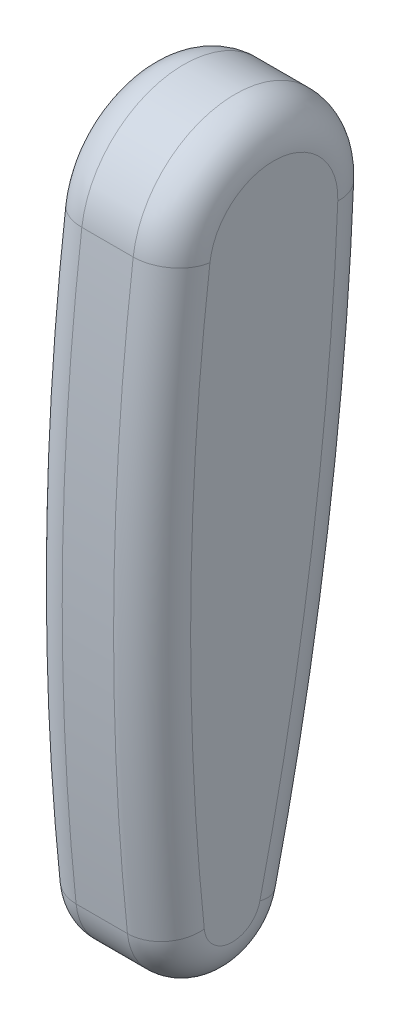
ISO-10303-21;
HEADER;
FILE_DESCRIPTION(('STEP AP214'),'2;1');
FILE_NAME('part.step','',(''),(''),'','','');
FILE_SCHEMA(('AUTOMOTIVE_DESIGN { 1 0 10303 214 1 1 1 1 }'));
ENDSEC;
DATA;
#1=APPLICATION_CONTEXT('core data for automotive mechanical design processes');
#2=APPLICATION_PROTOCOL_DEFINITION('international standard','automotive_design',2000,#1);
#3=PRODUCT_CONTEXT('',#1,'mechanical');
#4=PRODUCT('Part','Part','',(#3));
#5=PRODUCT_RELATED_PRODUCT_CATEGORY('part','',(#4));
#6=PRODUCT_DEFINITION_FORMATION('','',#4);
#7=PRODUCT_DEFINITION_CONTEXT('part definition',#1,'design');
#8=PRODUCT_DEFINITION('design','',#6,#7);
#9=PRODUCT_DEFINITION_SHAPE('','',#8);
#10=(LENGTH_UNIT() NAMED_UNIT(*) SI_UNIT(.MILLI.,.METRE.));
#11=(NAMED_UNIT(*) PLANE_ANGLE_UNIT() SI_UNIT($,.RADIAN.));
#12=(NAMED_UNIT(*) SI_UNIT($,.STERADIAN.) SOLID_ANGLE_UNIT());
#13=UNCERTAINTY_MEASURE_WITH_UNIT(LENGTH_MEASURE(1.E-05),#10,'distance_accuracy_value','');
#14=(GEOMETRIC_REPRESENTATION_CONTEXT(3) GLOBAL_UNCERTAINTY_ASSIGNED_CONTEXT((#13)) GLOBAL_UNIT_ASSIGNED_CONTEXT((#10,
#11,#12)) REPRESENTATION_CONTEXT('',''));
#15=CARTESIAN_POINT('',(0.,0.,0.));
#16=DIRECTION('',(0.,0.,1.));
#17=DIRECTION('',(1.,0.,0.));
#18=AXIS2_PLACEMENT_3D('',#15,#16,#17);
#19=CARTESIAN_POINT('',(222.25,-234.840307231112,-1250.38847130733));
#20=DIRECTION('',(1.,0.,0.));
#21=DIRECTION('',(0.,0.,-1.));
#22=AXIS2_PLACEMENT_3D('',#19,#20,#21);
#23=CYLINDRICAL_SURFACE('',#22,1270.);
#24=DIRECTION('',(1.,0.,0.));
#25=VECTOR('',#24,1.);
#26=CARTESIAN_POINT('',(222.25,-366.573375726702,12.7609255039649));
#27=LINE('',#26,#25);
#28=CARTESIAN_POINT('',(241.3,-366.573375726702,12.7609255039649));
#29=VERTEX_POINT('',#28);
#30=CARTESIAN_POINT('',(266.7,-366.573375726702,12.7609255039649));
#31=VERTEX_POINT('',#30);
#32=EDGE_CURVE('E140',#29,#31,#27,.T.);
#33=ORIENTED_EDGE('',*,*,#32,.T.);
#34=CARTESIAN_POINT('',(266.7,-234.840307231112,-1250.38847130733));
#35=DIRECTION('',(-1.,0.,0.));
#36=DIRECTION('',(0.,0.,1.));
#37=AXIS2_PLACEMENT_3D('',#34,#35,#36);
#38=CIRCLE('',#37,1270.);
#39=CARTESIAN_POINT('',(266.7,-78.2306079922428,9.91839692132181));
#40=VERTEX_POINT('',#39);
#41=EDGE_CURVE('E161',#31,#40,#38,.T.);
#42=ORIENTED_EDGE('',*,*,#41,.T.);
#43=DIRECTION('',(1.,0.,0.));
#44=VECTOR('',#43,1.);
#45=CARTESIAN_POINT('',(222.25,-78.2306079922428,9.91839692132181));
#46=LINE('',#45,#44);
#47=CARTESIAN_POINT('',(241.3,-78.2306079922428,9.91839692132181));
#48=VERTEX_POINT('',#47);
#49=EDGE_CURVE('E114',#48,#40,#46,.T.);
#50=ORIENTED_EDGE('',*,*,#49,.F.);
#51=CARTESIAN_POINT('',(241.3,-234.840307231112,-1250.38847130733));
#52=DIRECTION('',(-1.,0.,0.));
#53=DIRECTION('',(0.,0.,1.));
#54=AXIS2_PLACEMENT_3D('',#51,#52,#53);
#55=CIRCLE('',#54,1270.);
#56=EDGE_CURVE('E159',#48,#29,#55,.F.);
#57=ORIENTED_EDGE('',*,*,#56,.T.);
#58=EDGE_LOOP('',(#33,#42,#50,#57));
#59=FACE_BOUND('',#58,.T.);
#60=ADVANCED_FACE('F30',(#59),#23,.T.);
#61=CARTESIAN_POINT('',(222.25,-84.4949959617975,-40.4938778078239));
#62=DIRECTION('',(1.,0.,0.));
#63=DIRECTION('',(0.,0.,-1.));
#64=AXIS2_PLACEMENT_3D('',#61,#62,#63);
#65=CYLINDRICAL_SURFACE('',#64,50.7999999999996);
#66=ORIENTED_EDGE('',*,*,#49,.T.);
#67=CARTESIAN_POINT('',(266.7,-84.4949959617975,-40.4938778078239));
#68=DIRECTION('',(-1.,0.,0.));
#69=DIRECTION('',(0.,0.,1.));
#70=AXIS2_PLACEMENT_3D('',#67,#68,#69);
#71=CIRCLE('',#70,50.7999999999996);
#72=CARTESIAN_POINT('',(266.7,-86.6438502438308,-91.2484088890444));
#73=VERTEX_POINT('',#72);
#74=EDGE_CURVE('E113',#40,#73,#71,.T.);
#75=ORIENTED_EDGE('',*,*,#74,.T.);
#76=DIRECTION('',(1.,0.,0.));
#77=VECTOR('',#76,1.);
#78=CARTESIAN_POINT('',(222.25,-86.6438502438308,-91.2484088890444));
#79=LINE('',#78,#77);
#80=CARTESIAN_POINT('',(241.3,-86.6438502438308,-91.2484088890444));
#81=VERTEX_POINT('',#80);
#82=EDGE_CURVE('E96',#81,#73,#79,.T.);
#83=ORIENTED_EDGE('',*,*,#82,.F.);
#84=CARTESIAN_POINT('',(241.3,-84.4949959617975,-40.4938778078239));
#85=DIRECTION('',(-1.,0.,0.));
#86=DIRECTION('',(0.,0.,1.));
#87=AXIS2_PLACEMENT_3D('',#84,#85,#86);
#88=CIRCLE('',#87,50.7999999999996);
#89=EDGE_CURVE('E110',#81,#48,#88,.F.);
#90=ORIENTED_EDGE('',*,*,#89,.T.);
#91=EDGE_LOOP('',(#66,#75,#83,#90));
#92=FACE_BOUND('',#91,.T.);
#93=ADVANCED_FACE('F109',(#92),#65,.T.);
#94=CARTESIAN_POINT('',(222.25,-22.1782217828215,1431.38752354757));
#95=DIRECTION('',(1.,0.,0.));
#96=DIRECTION('',(0.,0.,-1.));
#97=AXIS2_PLACEMENT_3D('',#94,#95,#96);
#98=CYLINDRICAL_SURFACE('',#97,1524.);
#99=ORIENTED_EDGE('',*,*,#82,.T.);
#100=CARTESIAN_POINT('',(266.7,-22.1782217828215,1431.38752354757));
#101=DIRECTION('',(-1.,0.,0.));
#102=DIRECTION('',(0.,0.,1.));
#103=AXIS2_PLACEMENT_3D('',#100,#101,#102);
#104=CIRCLE('',#103,1524.);
#105=CARTESIAN_POINT('',(266.7,-370.699612750108,-52.2259166848305));
#106=VERTEX_POINT('',#105);
#107=EDGE_CURVE('E102',#73,#106,#104,.T.);
#108=ORIENTED_EDGE('',*,*,#107,.T.);
#109=DIRECTION('',(1.,0.,0.));
#110=VECTOR('',#109,1.);
#111=CARTESIAN_POINT('',(222.25,-370.699612750108,-52.2259166848305));
#112=LINE('',#111,#110);
#113=CARTESIAN_POINT('',(241.3,-370.699612750108,-52.2259166848305));
#114=VERTEX_POINT('',#113);
#115=EDGE_CURVE('E98',#114,#106,#112,.T.);
#116=ORIENTED_EDGE('',*,*,#115,.F.);
#117=CARTESIAN_POINT('',(241.3,-22.1782217828215,1431.38752354757));
#118=DIRECTION('',(-1.,0.,0.));
#119=DIRECTION('',(0.,0.,1.));
#120=AXIS2_PLACEMENT_3D('',#117,#118,#119);
#121=CIRCLE('',#120,1524.);
#122=EDGE_CURVE('E93',#114,#81,#121,.F.);
#123=ORIENTED_EDGE('',*,*,#122,.T.);
#124=EDGE_LOOP('',(#99,#108,#116,#123));
#125=FACE_BOUND('',#124,.T.);
#126=ADVANCED_FACE('F95',(#125),#98,.T.);
#127=CARTESIAN_POINT('',(222.25,-363.148315945816,-20.0809588131286));
#128=DIRECTION('',(1.,0.,0.));
#129=DIRECTION('',(0.,0.,-1.));
#130=AXIS2_PLACEMENT_3D('',#127,#128,#129);
#131=CYLINDRICAL_SURFACE('',#130,33.0199999999998);
#132=ORIENTED_EDGE('',*,*,#115,.T.);
#133=CARTESIAN_POINT('',(266.7,-363.148315945816,-20.0809588131286));
#134=DIRECTION('',(-1.,0.,0.));
#135=DIRECTION('',(0.,0.,1.));
#136=AXIS2_PLACEMENT_3D('',#133,#134,#135);
#137=CIRCLE('',#136,33.0199999999998);
#138=EDGE_CURVE('E157',#106,#31,#137,.T.);
#139=ORIENTED_EDGE('',*,*,#138,.T.);
#140=ORIENTED_EDGE('',*,*,#32,.F.);
#141=CARTESIAN_POINT('',(241.3,-363.148315945816,-20.0809588131286));
#142=DIRECTION('',(-1.,0.,0.));
#143=DIRECTION('',(0.,0.,1.));
#144=AXIS2_PLACEMENT_3D('',#141,#142,#143);
#145=CIRCLE('',#144,33.0199999999998);
#146=EDGE_CURVE('E155',#29,#114,#145,.F.);
#147=ORIENTED_EDGE('',*,*,#146,.T.);
#148=EDGE_LOOP('',(#132,#139,#140,#147));
#149=FACE_BOUND('',#148,.T.);
#150=ADVANCED_FACE('F177',(#149),#131,.T.);
#151=CARTESIAN_POINT('',(222.25,-159.667651596455,-645.441174557577));
#152=DIRECTION('',(-1.,0.,0.));
#153=DIRECTION('',(0.,0.,1.));
#154=AXIS2_PLACEMENT_3D('',#151,#152,#153);
#155=PLANE('',#154);
#156=CARTESIAN_POINT('',(222.25,-22.1782217828215,1431.38752354757));
#157=DIRECTION('',(-1.,0.,0.));
#158=DIRECTION('',(0.,0.,1.));
#159=AXIS2_PLACEMENT_3D('',#156,#157,#158);
#160=CIRCLE('',#159,1504.95);
#161=CARTESIAN_POINT('',(222.25,-85.8380298880682,-72.2154597335864));
#162=VERTEX_POINT('',#161);
#163=CARTESIAN_POINT('',(222.25,-366.343095363017,-33.6807486819255));
#164=VERTEX_POINT('',#163);
#165=EDGE_CURVE('E37',#162,#164,#160,.T.);
#166=ORIENTED_EDGE('',*,*,#165,.T.);
#167=CARTESIAN_POINT('',(222.25,-363.148315945816,-20.0809588131286));
#168=DIRECTION('',(-1.,0.,0.));
#169=DIRECTION('',(0.,0.,1.));
#170=AXIS2_PLACEMENT_3D('',#167,#168,#169);
#171=CIRCLE('',#170,13.9699999999998);
#172=CARTESIAN_POINT('',(222.25,-364.597379699268,-6.18631544820469));
#173=VERTEX_POINT('',#172);
#174=EDGE_CURVE('E11',#164,#173,#171,.T.);
#175=ORIENTED_EDGE('',*,*,#174,.T.);
#176=CARTESIAN_POINT('',(222.25,-234.840307231112,-1250.38847130733));
#177=DIRECTION('',(-1.,0.,0.));
#178=DIRECTION('',(0.,0.,1.));
#179=AXIS2_PLACEMENT_3D('',#176,#177,#178);
#180=CIRCLE('',#179,1250.95);
#181=CARTESIAN_POINT('',(222.25,-80.5797534808258,-8.98620610210795));
#182=VERTEX_POINT('',#181);
#183=EDGE_CURVE('E163',#173,#182,#180,.T.);
#184=ORIENTED_EDGE('',*,*,#183,.T.);
#185=CARTESIAN_POINT('',(222.25,-84.4949959617975,-40.4938778078239));
#186=DIRECTION('',(-1.,0.,0.));
#187=DIRECTION('',(0.,0.,1.));
#188=AXIS2_PLACEMENT_3D('',#185,#186,#187);
#189=CIRCLE('',#188,31.7499999999996);
#190=EDGE_CURVE('E47',#182,#162,#189,.T.);
#191=ORIENTED_EDGE('',*,*,#190,.T.);
#192=EDGE_LOOP('',(#166,#175,#184,#191));
#193=FACE_BOUND('',#192,.T.);
#194=ADVANCED_FACE('F166',(#193),#155,.T.);
#195=CARTESIAN_POINT('',(285.75,-159.667651596455,-645.441174557577));
#196=DIRECTION('',(-1.,0.,0.));
#197=DIRECTION('',(0.,0.,1.));
#198=AXIS2_PLACEMENT_3D('',#195,#196,#197);
#199=PLANE('',#198);
#200=CARTESIAN_POINT('',(285.75,-22.1782217828215,1431.38752354757));
#201=DIRECTION('',(-1.,0.,0.));
#202=DIRECTION('',(0.,0.,1.));
#203=AXIS2_PLACEMENT_3D('',#200,#201,#202);
#204=CIRCLE('',#203,1504.95);
#205=CARTESIAN_POINT('',(285.75,-366.343095363016,-33.6807486819255));
#206=VERTEX_POINT('',#205);
#207=CARTESIAN_POINT('',(285.75,-85.8380298880683,-72.2154597335864));
#208=VERTEX_POINT('',#207);
#209=EDGE_CURVE('E150',#206,#208,#204,.F.);
#210=ORIENTED_EDGE('',*,*,#209,.T.);
#211=CARTESIAN_POINT('',(285.75,-84.4949959617975,-40.4938778078239));
#212=DIRECTION('',(-1.,0.,0.));
#213=DIRECTION('',(0.,0.,1.));
#214=AXIS2_PLACEMENT_3D('',#211,#212,#213);
#215=CIRCLE('',#214,31.7499999999996);
#216=CARTESIAN_POINT('',(285.75,-80.5797534808258,-8.98620610210795));
#217=VERTEX_POINT('',#216);
#218=EDGE_CURVE('E103',#208,#217,#215,.F.);
#219=ORIENTED_EDGE('',*,*,#218,.T.);
#220=CARTESIAN_POINT('',(285.75,-234.840307231112,-1250.38847130733));
#221=DIRECTION('',(-1.,0.,0.));
#222=DIRECTION('',(0.,0.,1.));
#223=AXIS2_PLACEMENT_3D('',#220,#221,#222);
#224=CIRCLE('',#223,1250.95);
#225=CARTESIAN_POINT('',(285.75,-364.597379699268,-6.18631544820469));
#226=VERTEX_POINT('',#225);
#227=EDGE_CURVE('E146',#217,#226,#224,.F.);
#228=ORIENTED_EDGE('',*,*,#227,.T.);
#229=CARTESIAN_POINT('',(285.75,-363.148315945816,-20.0809588131286));
#230=DIRECTION('',(-1.,0.,0.));
#231=DIRECTION('',(0.,0.,1.));
#232=AXIS2_PLACEMENT_3D('',#229,#230,#231);
#233=CIRCLE('',#232,13.9699999999998);
#234=EDGE_CURVE('E148',#226,#206,#233,.F.);
#235=ORIENTED_EDGE('',*,*,#234,.T.);
#236=EDGE_LOOP('',(#210,#219,#228,#235));
#237=FACE_BOUND('',#236,.T.);
#238=ADVANCED_FACE('F201',(#237),#199,.F.);
#239=CARTESIAN_POINT('',(266.7,-363.148315945816,-20.0809588131286));
#240=DIRECTION('',(-1.,0.,0.));
#241=DIRECTION('',(0.,0.,1.));
#242=AXIS2_PLACEMENT_3D('',#239,#240,#241);
#243=DEGENERATE_TOROIDAL_SURFACE('',#242,13.9699999999998,19.05,.T.);
#244=CARTESIAN_POINT('',(266.7,-366.343095363016,-33.6807486819255));
#245=DIRECTION('',(0.,0.973499632698428,-0.228688576750188));
#246=DIRECTION('',(0.,0.228688576750188,0.973499632698428));
#247=AXIS2_PLACEMENT_3D('',#244,#245,#246);
#248=CIRCLE('',#247,19.05);
#249=EDGE_CURVE('E134',#206,#106,#248,.T.);
#250=ORIENTED_EDGE('',*,*,#249,.F.);
#251=ORIENTED_EDGE('',*,*,#234,.F.);
#252=CARTESIAN_POINT('',(266.7,-364.597379699268,-6.18631544820453));
#253=DIRECTION('',(0.,0.994605824260862,0.103726825587077));
#254=DIRECTION('',(0.,-0.103726825587077,0.994605824260862));
#255=AXIS2_PLACEMENT_3D('',#252,#253,#254);
#256=CIRCLE('',#255,19.05);
#257=EDGE_CURVE('E137',#31,#226,#256,.T.);
#258=ORIENTED_EDGE('',*,*,#257,.F.);
#259=ORIENTED_EDGE('',*,*,#138,.F.);
#260=EDGE_LOOP('',(#250,#251,#258,#259));
#261=FACE_BOUND('',#260,.T.);
#262=ADVANCED_FACE('F204',(#261),#243,.T.);
#263=CARTESIAN_POINT('',(266.7,-234.840307231112,-1250.38847130733));
#264=DIRECTION('',(-1.,0.,0.));
#265=DIRECTION('',(0.,0.,1.));
#266=AXIS2_PLACEMENT_3D('',#263,#264,#265);
#267=TOROIDAL_SURFACE('',#266,1250.95,19.05);
#268=ORIENTED_EDGE('',*,*,#257,.T.);
#269=ORIENTED_EDGE('',*,*,#227,.F.);
#270=CARTESIAN_POINT('',(266.7,-80.5797534808259,-8.98620610210806));
#271=DIRECTION('',(0.,0.992367612778466,-0.123314723810134));
#272=DIRECTION('',(0.,0.123314723810134,0.992367612778466));
#273=AXIS2_PLACEMENT_3D('',#270,#271,#272);
#274=CIRCLE('',#273,19.05);
#275=EDGE_CURVE('E127',#40,#217,#274,.T.);
#276=ORIENTED_EDGE('',*,*,#275,.F.);
#277=ORIENTED_EDGE('',*,*,#41,.F.);
#278=EDGE_LOOP('',(#268,#269,#276,#277));
#279=FACE_BOUND('',#278,.T.);
#280=ADVANCED_FACE('F208',(#279),#267,.T.);
#281=CARTESIAN_POINT('',(266.7,-22.1782217828215,1431.38752354757));
#282=DIRECTION('',(-1.,0.,0.));
#283=DIRECTION('',(0.,0.,1.));
#284=AXIS2_PLACEMENT_3D('',#281,#282,#283);
#285=TOROIDAL_SURFACE('',#284,1504.95,19.05);
#286=ORIENTED_EDGE('',*,*,#249,.T.);
#287=ORIENTED_EDGE('',*,*,#107,.F.);
#288=CARTESIAN_POINT('',(266.7,-85.8380298880683,-72.2154597335864));
#289=DIRECTION('',(0.,0.999104942543713,-0.0423002811423871));
#290=DIRECTION('',(0.,0.0423002811423871,0.999104942543713));
#291=AXIS2_PLACEMENT_3D('',#288,#289,#290);
#292=CIRCLE('',#291,19.05);
#293=EDGE_CURVE('E125',#208,#73,#292,.T.);
#294=ORIENTED_EDGE('',*,*,#293,.F.);
#295=ORIENTED_EDGE('',*,*,#209,.F.);
#296=EDGE_LOOP('',(#286,#287,#294,#295));
#297=FACE_BOUND('',#296,.T.);
#298=ADVANCED_FACE('F212',(#297),#285,.T.);
#299=CARTESIAN_POINT('',(266.7,-84.4949959617975,-40.4938778078239));
#300=DIRECTION('',(-1.,0.,0.));
#301=DIRECTION('',(0.,0.,1.));
#302=AXIS2_PLACEMENT_3D('',#299,#300,#301);
#303=TOROIDAL_SURFACE('',#302,31.7499999999996,19.05);
#304=ORIENTED_EDGE('',*,*,#275,.T.);
#305=ORIENTED_EDGE('',*,*,#218,.F.);
#306=ORIENTED_EDGE('',*,*,#293,.T.);
#307=ORIENTED_EDGE('',*,*,#74,.F.);
#308=EDGE_LOOP('',(#304,#305,#306,#307));
#309=FACE_BOUND('',#308,.T.);
#310=ADVANCED_FACE('F216',(#309),#303,.T.);
#311=CARTESIAN_POINT('',(241.3,-84.4949959617975,-40.4938778078239));
#312=DIRECTION('',(-1.,0.,0.));
#313=DIRECTION('',(0.,0.,1.));
#314=AXIS2_PLACEMENT_3D('',#311,#312,#313);
#315=TOROIDAL_SURFACE('',#314,31.7499999999996,19.05);
#316=CARTESIAN_POINT('',(241.3,-80.5797534808258,-8.98620610210795));
#317=DIRECTION('',(0.,-0.992367612778466,0.123314723810133));
#318=DIRECTION('',(0.,-0.123314723810133,-0.992367612778466));
#319=AXIS2_PLACEMENT_3D('',#316,#317,#318);
#320=CIRCLE('',#319,19.05);
#321=EDGE_CURVE('E121',#48,#182,#320,.T.);
#322=ORIENTED_EDGE('',*,*,#321,.F.);
#323=ORIENTED_EDGE('',*,*,#89,.F.);
#324=CARTESIAN_POINT('',(241.3,-85.8380298880682,-72.2154597335864));
#325=DIRECTION('',(0.,-0.999104942543712,0.0423002811423944));
#326=DIRECTION('',(0.,-0.0423002811423944,-0.999104942543712));
#327=AXIS2_PLACEMENT_3D('',#324,#325,#326);
#328=CIRCLE('',#327,19.05);
#329=EDGE_CURVE('E119',#162,#81,#328,.T.);
#330=ORIENTED_EDGE('',*,*,#329,.F.);
#331=ORIENTED_EDGE('',*,*,#190,.F.);
#332=EDGE_LOOP('',(#322,#323,#330,#331));
#333=FACE_BOUND('',#332,.T.);
#334=ADVANCED_FACE('F118',(#333),#315,.T.);
#335=CARTESIAN_POINT('',(241.3,-22.1782217828215,1431.38752354757));
#336=DIRECTION('',(-1.,0.,0.));
#337=DIRECTION('',(0.,0.,1.));
#338=AXIS2_PLACEMENT_3D('',#335,#336,#337);
#339=TOROIDAL_SURFACE('',#338,1504.95,19.05);
#340=ORIENTED_EDGE('',*,*,#329,.T.);
#341=ORIENTED_EDGE('',*,*,#122,.F.);
#342=CARTESIAN_POINT('',(241.3,-366.343095363017,-33.6807486819255));
#343=DIRECTION('',(0.,-0.973499632698428,0.228688576750185));
#344=DIRECTION('',(0.,-0.228688576750185,-0.973499632698428));
#345=AXIS2_PLACEMENT_3D('',#342,#343,#344);
#346=CIRCLE('',#345,19.05);
#347=EDGE_CURVE('E129',#164,#114,#346,.T.);
#348=ORIENTED_EDGE('',*,*,#347,.F.);
#349=ORIENTED_EDGE('',*,*,#165,.F.);
#350=EDGE_LOOP('',(#340,#341,#348,#349));
#351=FACE_BOUND('',#350,.T.);
#352=ADVANCED_FACE('F124',(#351),#339,.T.);
#353=CARTESIAN_POINT('',(241.3,-234.840307231112,-1250.38847130733));
#354=DIRECTION('',(-1.,0.,0.));
#355=DIRECTION('',(0.,0.,1.));
#356=AXIS2_PLACEMENT_3D('',#353,#354,#355);
#357=TOROIDAL_SURFACE('',#356,1250.95,19.05);
#358=ORIENTED_EDGE('',*,*,#321,.T.);
#359=ORIENTED_EDGE('',*,*,#183,.F.);
#360=CARTESIAN_POINT('',(241.3,-364.597379699268,-6.18631544820463));
#361=DIRECTION('',(0.,-0.994605824260862,-0.103726825587077));
#362=DIRECTION('',(0.,0.103726825587077,-0.994605824260862));
#363=AXIS2_PLACEMENT_3D('',#360,#361,#362);
#364=CIRCLE('',#363,19.05);
#365=EDGE_CURVE('E171',#29,#173,#364,.T.);
#366=ORIENTED_EDGE('',*,*,#365,.F.);
#367=ORIENTED_EDGE('',*,*,#56,.F.);
#368=EDGE_LOOP('',(#358,#359,#366,#367));
#369=FACE_BOUND('',#368,.T.);
#370=ADVANCED_FACE('F170',(#369),#357,.T.);
#371=CARTESIAN_POINT('',(241.3,-363.148315945816,-20.0809588131286));
#372=DIRECTION('',(-1.,0.,0.));
#373=DIRECTION('',(0.,0.,1.));
#374=AXIS2_PLACEMENT_3D('',#371,#372,#373);
#375=DEGENERATE_TOROIDAL_SURFACE('',#374,13.9699999999998,19.05,.T.);
#376=ORIENTED_EDGE('',*,*,#347,.T.);
#377=ORIENTED_EDGE('',*,*,#146,.F.);
#378=ORIENTED_EDGE('',*,*,#365,.T.);
#379=ORIENTED_EDGE('',*,*,#174,.F.);
#380=EDGE_LOOP('',(#376,#377,#378,#379));
#381=FACE_BOUND('',#380,.T.);
#382=ADVANCED_FACE('F180',(#381),#375,.T.);
#383=CLOSED_SHELL('',(#60,#93,#126,#150,#194,#238,#262,#280,#298,#310,#334,#352,#370,#382));
#384=MANIFOLD_SOLID_BREP('B2',#383);
#385=ADVANCED_BREP_SHAPE_REPRESENTATION('',(#18,#384),#14);
#386=SHAPE_DEFINITION_REPRESENTATION(#9,#385);
ENDSEC;
END-ISO-10303-21;
